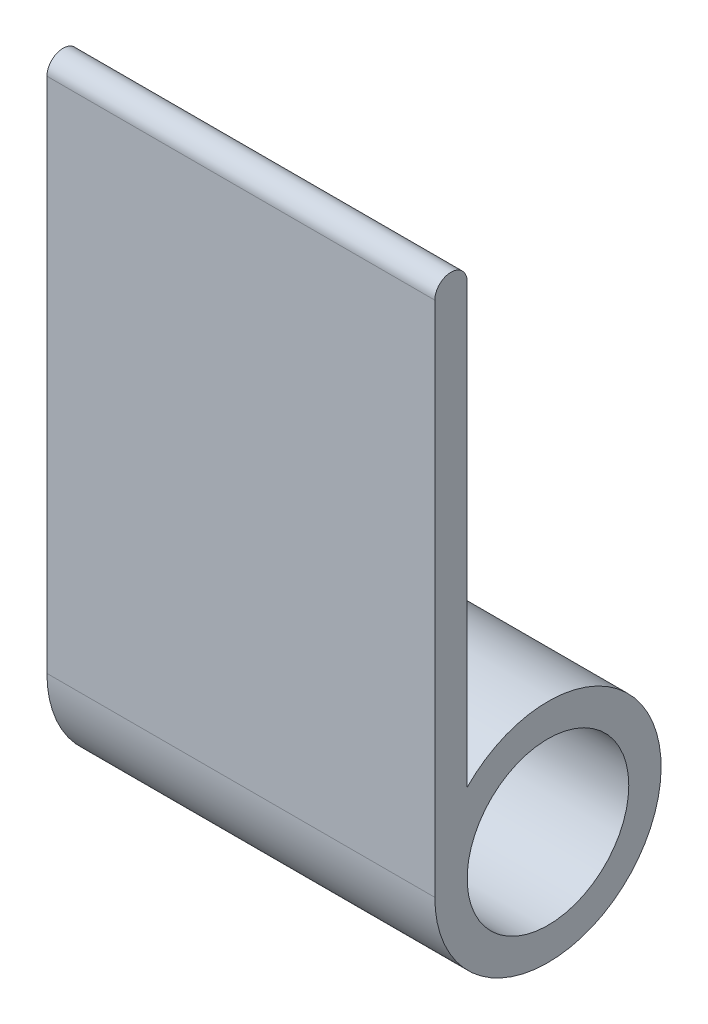
ISO-10303-21;
HEADER;
FILE_DESCRIPTION(('STEP AP214'),'2;1');
FILE_NAME('part.step','',(''),(''),'','','');
FILE_SCHEMA(('AUTOMOTIVE_DESIGN { 1 0 10303 214 1 1 1 1 }'));
ENDSEC;
DATA;
#1=APPLICATION_CONTEXT('core data for automotive mechanical design processes');
#2=APPLICATION_PROTOCOL_DEFINITION('international standard','automotive_design',2000,#1);
#3=PRODUCT_CONTEXT('',#1,'mechanical');
#4=PRODUCT('Part','Part','',(#3));
#5=PRODUCT_RELATED_PRODUCT_CATEGORY('part','',(#4));
#6=PRODUCT_DEFINITION_FORMATION('','',#4);
#7=PRODUCT_DEFINITION_CONTEXT('part definition',#1,'design');
#8=PRODUCT_DEFINITION('design','',#6,#7);
#9=PRODUCT_DEFINITION_SHAPE('','',#8);
#10=(LENGTH_UNIT() NAMED_UNIT(*) SI_UNIT(.MILLI.,.METRE.));
#11=(NAMED_UNIT(*) PLANE_ANGLE_UNIT() SI_UNIT($,.RADIAN.));
#12=(NAMED_UNIT(*) SI_UNIT($,.STERADIAN.) SOLID_ANGLE_UNIT());
#13=UNCERTAINTY_MEASURE_WITH_UNIT(LENGTH_MEASURE(1.E-05),#10,'distance_accuracy_value','');
#14=(GEOMETRIC_REPRESENTATION_CONTEXT(3) GLOBAL_UNCERTAINTY_ASSIGNED_CONTEXT((#13)) GLOBAL_UNIT_ASSIGNED_CONTEXT((#10,
#11,#12)) REPRESENTATION_CONTEXT('',''));
#15=CARTESIAN_POINT('',(0.,0.,0.));
#16=DIRECTION('',(0.,0.,1.));
#17=DIRECTION('',(1.,0.,0.));
#18=AXIS2_PLACEMENT_3D('',#15,#16,#17);
#19=CARTESIAN_POINT('',(60.,80.,12.5));
#20=DIRECTION('',(0.,0.,1.));
#21=DIRECTION('',(0.,-1.,0.));
#22=AXIS2_PLACEMENT_3D('',#19,#20,#21);
#23=PLANE('',#22);
#24=DIRECTION('',(-1.,0.,0.));
#25=VECTOR('',#24,1.);
#26=CARTESIAN_POINT('',(5.,41.9205080756888,12.5));
#27=LINE('',#26,#25);
#28=CARTESIAN_POINT('',(5.,41.9205080756888,12.5));
#29=VERTEX_POINT('',#28);
#30=CARTESIAN_POINT('',(0.,41.9205080756888,12.5));
#31=VERTEX_POINT('',#30);
#32=EDGE_CURVE('E147',#29,#31,#27,.T.);
#33=ORIENTED_EDGE('',*,*,#32,.T.);
#34=DIRECTION('',(0.,1.,0.));
#35=VECTOR('',#34,1.);
#36=CARTESIAN_POINT('',(0.,80.,12.5));
#37=LINE('',#36,#35);
#38=CARTESIAN_POINT('',(0.,80.,12.5));
#39=VERTEX_POINT('',#38);
#40=EDGE_CURVE('E182',#31,#39,#37,.T.);
#41=ORIENTED_EDGE('',*,*,#40,.T.);
#42=DIRECTION('',(-1.,0.,0.));
#43=VECTOR('',#42,1.);
#44=CARTESIAN_POINT('',(60.,80.,12.5));
#45=LINE('',#44,#43);
#46=CARTESIAN_POINT('',(60.,80.,12.5));
#47=VERTEX_POINT('',#46);
#48=EDGE_CURVE('E191',#47,#39,#45,.T.);
#49=ORIENTED_EDGE('',*,*,#48,.F.);
#50=DIRECTION('',(0.,1.,0.));
#51=VECTOR('',#50,1.);
#52=CARTESIAN_POINT('',(60.,80.,12.5));
#53=LINE('',#52,#51);
#54=CARTESIAN_POINT('',(60.,12.2474487139159,12.5));
#55=VERTEX_POINT('',#54);
#56=EDGE_CURVE('E188',#55,#47,#53,.T.);
#57=ORIENTED_EDGE('',*,*,#56,.F.);
#58=DIRECTION('',(-1.,0.,0.));
#59=VECTOR('',#58,1.);
#60=CARTESIAN_POINT('',(60.,12.2474487139159,12.5));
#61=LINE('',#60,#59);
#62=CARTESIAN_POINT('',(5.,12.2474487139159,12.5));
#63=VERTEX_POINT('',#62);
#64=EDGE_CURVE('E205',#55,#63,#61,.T.);
#65=ORIENTED_EDGE('',*,*,#64,.T.);
#66=DIRECTION('',(0.,1.,0.));
#67=VECTOR('',#66,1.);
#68=CARTESIAN_POINT('',(5.,0.,12.5));
#69=LINE('',#68,#67);
#70=EDGE_CURVE('E137',#63,#29,#69,.T.);
#71=ORIENTED_EDGE('',*,*,#70,.T.);
#72=EDGE_LOOP('',(#33,#41,#49,#57,#65,#71));
#73=FACE_BOUND('',#72,.T.);
#74=ADVANCED_FACE('F43',(#73),#23,.F.);
#75=CARTESIAN_POINT('',(60.,80.,15.));
#76=DIRECTION('',(-1.,0.,0.));
#77=DIRECTION('',(0.,0.,1.));
#78=AXIS2_PLACEMENT_3D('',#75,#76,#77);
#79=PLANE('',#78);
#80=CARTESIAN_POINT('',(60.,80.,15.));
#81=DIRECTION('',(1.,0.,0.));
#82=DIRECTION('',(0.,0.,1.));
#83=AXIS2_PLACEMENT_3D('',#80,#81,#82);
#84=CIRCLE('',#83,2.5);
#85=CARTESIAN_POINT('',(60.,80.,17.5));
#86=VERTEX_POINT('',#85);
#87=EDGE_CURVE('E177',#47,#86,#84,.T.);
#88=ORIENTED_EDGE('',*,*,#87,.T.);
#89=DIRECTION('',(0.,-1.,0.));
#90=VECTOR('',#89,1.);
#91=CARTESIAN_POINT('',(60.,0.,17.5));
#92=LINE('',#91,#90);
#93=CARTESIAN_POINT('',(60.,0.,17.5));
#94=VERTEX_POINT('',#93);
#95=EDGE_CURVE('E181',#86,#94,#92,.T.);
#96=ORIENTED_EDGE('',*,*,#95,.T.);
#97=CARTESIAN_POINT('',(60.,0.,0.));
#98=DIRECTION('',(1.,0.,0.));
#99=DIRECTION('',(0.,0.,-1.));
#100=AXIS2_PLACEMENT_3D('',#97,#98,#99);
#101=CIRCLE('',#100,17.5);
#102=EDGE_CURVE('E185',#94,#55,#101,.T.);
#103=ORIENTED_EDGE('',*,*,#102,.T.);
#104=ORIENTED_EDGE('',*,*,#56,.T.);
#105=EDGE_LOOP('',(#88,#96,#103,#104));
#106=FACE_BOUND('',#105,.T.);
#107=CARTESIAN_POINT('',(60.,0.,0.));
#108=DIRECTION('',(1.,0.,0.));
#109=DIRECTION('',(0.,0.,-1.));
#110=AXIS2_PLACEMENT_3D('',#107,#108,#109);
#111=CIRCLE('',#110,12.5);
#112=CARTESIAN_POINT('',(60.,0.,-12.5));
#113=VERTEX_POINT('',#112);
#114=EDGE_CURVE('E169',#113,#113,#111,.T.);
#115=ORIENTED_EDGE('',*,*,#114,.F.);
#116=EDGE_LOOP('',(#115));
#117=FACE_BOUND('',#116,.T.);
#118=ADVANCED_FACE('F228',(#106,#117),#79,.F.);
#119=CARTESIAN_POINT('',(0.,80.,15.));
#120=DIRECTION('',(-1.,0.,0.));
#121=DIRECTION('',(0.,0.,1.));
#122=AXIS2_PLACEMENT_3D('',#119,#120,#121);
#123=PLANE('',#122);
#124=CARTESIAN_POINT('',(0.,80.,15.));
#125=DIRECTION('',(1.,0.,0.));
#126=DIRECTION('',(0.,0.,1.));
#127=AXIS2_PLACEMENT_3D('',#124,#125,#126);
#128=CIRCLE('',#127,2.5);
#129=CARTESIAN_POINT('',(0.,80.,17.5));
#130=VERTEX_POINT('',#129);
#131=EDGE_CURVE('E173',#39,#130,#128,.T.);
#132=ORIENTED_EDGE('',*,*,#131,.F.);
#133=ORIENTED_EDGE('',*,*,#40,.F.);
#134=DIRECTION('',(0.,0.,1.));
#135=VECTOR('',#134,1.);
#136=CARTESIAN_POINT('',(0.,41.9205080756888,0.));
#137=LINE('',#136,#135);
#138=CARTESIAN_POINT('',(0.,41.9205080756888,-2.5));
#139=VERTEX_POINT('',#138);
#140=EDGE_CURVE('E153',#139,#31,#137,.T.);
#141=ORIENTED_EDGE('',*,*,#140,.F.);
#142=CARTESIAN_POINT('',(0.,33.3205080756888,-2.5));
#143=DIRECTION('',(1.,0.,0.));
#144=DIRECTION('',(0.,0.,-1.));
#145=AXIS2_PLACEMENT_3D('',#142,#143,#144);
#146=CIRCLE('',#145,8.6);
#147=CARTESIAN_POINT('',(0.,24.7205080756888,-2.5));
#148=VERTEX_POINT('',#147);
#149=EDGE_CURVE('E150',#139,#148,#146,.F.);
#150=ORIENTED_EDGE('',*,*,#149,.T.);
#151=DIRECTION('',(0.,-1.,0.));
#152=VECTOR('',#151,1.);
#153=CARTESIAN_POINT('',(0.,0.,-2.5));
#154=LINE('',#153,#152);
#155=CARTESIAN_POINT('',(0.,17.3205080756888,-2.5));
#156=VERTEX_POINT('',#155);
#157=EDGE_CURVE('E113',#148,#156,#154,.T.);
#158=ORIENTED_EDGE('',*,*,#157,.T.);
#159=CARTESIAN_POINT('',(0.,0.,0.));
#160=DIRECTION('',(1.,0.,0.));
#161=DIRECTION('',(0.,0.,-1.));
#162=AXIS2_PLACEMENT_3D('',#159,#160,#161);
#163=CIRCLE('',#162,17.5);
#164=CARTESIAN_POINT('',(0.,0.,17.5));
#165=VERTEX_POINT('',#164);
#166=EDGE_CURVE('E64',#165,#156,#163,.T.);
#167=ORIENTED_EDGE('',*,*,#166,.F.);
#168=DIRECTION('',(0.,-1.,0.));
#169=VECTOR('',#168,1.);
#170=CARTESIAN_POINT('',(0.,0.,17.5));
#171=LINE('',#170,#169);
#172=EDGE_CURVE('E195',#130,#165,#171,.T.);
#173=ORIENTED_EDGE('',*,*,#172,.F.);
#174=EDGE_LOOP('',(#132,#133,#141,#150,#158,#167,#173));
#175=FACE_BOUND('',#174,.T.);
#176=CARTESIAN_POINT('',(0.,0.,0.));
#177=DIRECTION('',(1.,0.,0.));
#178=DIRECTION('',(0.,0.,-1.));
#179=AXIS2_PLACEMENT_3D('',#176,#177,#178);
#180=CIRCLE('',#179,12.5);
#181=CARTESIAN_POINT('',(0.,0.,-12.5));
#182=VERTEX_POINT('',#181);
#183=EDGE_CURVE('E168',#182,#182,#180,.T.);
#184=ORIENTED_EDGE('',*,*,#183,.T.);
#185=EDGE_LOOP('',(#184));
#186=FACE_BOUND('',#185,.T.);
#187=CARTESIAN_POINT('',(0.,33.3205080756888,-2.5));
#188=DIRECTION('',(1.,0.,0.));
#189=DIRECTION('',(0.,0.,-1.));
#190=AXIS2_PLACEMENT_3D('',#187,#188,#189);
#191=CIRCLE('',#190,5.6);
#192=CARTESIAN_POINT('',(0.,33.3205080756888,-8.1));
#193=VERTEX_POINT('',#192);
#194=EDGE_CURVE('E157',#193,#193,#191,.T.);
#195=ORIENTED_EDGE('',*,*,#194,.T.);
#196=EDGE_LOOP('',(#195));
#197=FACE_BOUND('',#196,.T.);
#198=ADVANCED_FACE('F216',(#175,#186,#197),#123,.T.);
#199=CARTESIAN_POINT('',(60.,80.,15.));
#200=DIRECTION('',(-1.,0.,0.));
#201=DIRECTION('',(0.,0.,1.));
#202=AXIS2_PLACEMENT_3D('',#199,#200,#201);
#203=CYLINDRICAL_SURFACE('',#202,2.5);
#204=ORIENTED_EDGE('',*,*,#131,.T.);
#205=DIRECTION('',(-1.,0.,0.));
#206=VECTOR('',#205,1.);
#207=CARTESIAN_POINT('',(60.,80.,17.5));
#208=LINE('',#207,#206);
#209=EDGE_CURVE('E11',#86,#130,#208,.T.);
#210=ORIENTED_EDGE('',*,*,#209,.F.);
#211=ORIENTED_EDGE('',*,*,#87,.F.);
#212=ORIENTED_EDGE('',*,*,#48,.T.);
#213=EDGE_LOOP('',(#204,#210,#211,#212));
#214=FACE_BOUND('',#213,.T.);
#215=ADVANCED_FACE('F45',(#214),#203,.T.);
#216=CARTESIAN_POINT('',(60.,0.,17.5));
#217=DIRECTION('',(0.,0.,-1.));
#218=DIRECTION('',(0.,1.,0.));
#219=AXIS2_PLACEMENT_3D('',#216,#217,#218);
#220=PLANE('',#219);
#221=ORIENTED_EDGE('',*,*,#172,.T.);
#222=DIRECTION('',(-1.,0.,0.));
#223=VECTOR('',#222,1.);
#224=CARTESIAN_POINT('',(60.,0.,17.5));
#225=LINE('',#224,#223);
#226=EDGE_CURVE('E52',#94,#165,#225,.T.);
#227=ORIENTED_EDGE('',*,*,#226,.F.);
#228=ORIENTED_EDGE('',*,*,#95,.F.);
#229=ORIENTED_EDGE('',*,*,#209,.T.);
#230=EDGE_LOOP('',(#221,#227,#228,#229));
#231=FACE_BOUND('',#230,.T.);
#232=ADVANCED_FACE('F231',(#231),#220,.F.);
#233=CARTESIAN_POINT('',(60.,0.,0.));
#234=DIRECTION('',(-1.,0.,0.));
#235=DIRECTION('',(0.,0.,1.));
#236=AXIS2_PLACEMENT_3D('',#233,#234,#235);
#237=CYLINDRICAL_SURFACE('',#236,17.5);
#238=ORIENTED_EDGE('',*,*,#166,.T.);
#239=DIRECTION('',(-1.,0.,0.));
#240=VECTOR('',#239,1.);
#241=CARTESIAN_POINT('',(5.,17.3205080756888,-2.5));
#242=LINE('',#241,#240);
#243=CARTESIAN_POINT('',(5.,17.3205080756888,-2.5));
#244=VERTEX_POINT('',#243);
#245=EDGE_CURVE('E59',#244,#156,#242,.T.);
#246=ORIENTED_EDGE('',*,*,#245,.F.);
#247=CARTESIAN_POINT('',(5.,0.,0.));
#248=DIRECTION('',(1.,0.,0.));
#249=DIRECTION('',(0.,0.,-1.));
#250=AXIS2_PLACEMENT_3D('',#247,#248,#249);
#251=CIRCLE('',#250,17.5);
#252=EDGE_CURVE('E128',#244,#63,#251,.T.);
#253=ORIENTED_EDGE('',*,*,#252,.T.);
#254=ORIENTED_EDGE('',*,*,#64,.F.);
#255=ORIENTED_EDGE('',*,*,#102,.F.);
#256=ORIENTED_EDGE('',*,*,#226,.T.);
#257=EDGE_LOOP('',(#238,#246,#253,#254,#255,#256));
#258=FACE_BOUND('',#257,.T.);
#259=ADVANCED_FACE('F211',(#258),#237,.T.);
#260=CARTESIAN_POINT('',(60.,0.,0.));
#261=DIRECTION('',(-1.,0.,0.));
#262=DIRECTION('',(0.,0.,1.));
#263=AXIS2_PLACEMENT_3D('',#260,#261,#262);
#264=CYLINDRICAL_SURFACE('',#263,12.5);
#265=ORIENTED_EDGE('',*,*,#114,.T.);
#266=EDGE_LOOP('',(#265));
#267=FACE_BOUND('',#266,.T.);
#268=ORIENTED_EDGE('',*,*,#183,.F.);
#269=EDGE_LOOP('',(#268));
#270=FACE_BOUND('',#269,.T.);
#271=ADVANCED_FACE('F247',(#267,#270),#264,.F.);
#272=CARTESIAN_POINT('',(5.,0.,-2.5));
#273=DIRECTION('',(0.,0.,-1.));
#274=DIRECTION('',(0.,1.,0.));
#275=AXIS2_PLACEMENT_3D('',#272,#273,#274);
#276=PLANE('',#275);
#277=ORIENTED_EDGE('',*,*,#157,.F.);
#278=DIRECTION('',(-1.,0.,0.));
#279=VECTOR('',#278,1.);
#280=CARTESIAN_POINT('',(5.,24.7205080756888,-2.5));
#281=LINE('',#280,#279);
#282=CARTESIAN_POINT('',(5.,24.7205080756888,-2.5));
#283=VERTEX_POINT('',#282);
#284=EDGE_CURVE('E108',#283,#148,#281,.T.);
#285=ORIENTED_EDGE('',*,*,#284,.F.);
#286=DIRECTION('',(0.,-1.,0.));
#287=VECTOR('',#286,1.);
#288=CARTESIAN_POINT('',(5.,0.,-2.5));
#289=LINE('',#288,#287);
#290=EDGE_CURVE('E111',#283,#244,#289,.T.);
#291=ORIENTED_EDGE('',*,*,#290,.T.);
#292=ORIENTED_EDGE('',*,*,#245,.T.);
#293=EDGE_LOOP('',(#277,#285,#291,#292));
#294=FACE_BOUND('',#293,.T.);
#295=ADVANCED_FACE('F110',(#294),#276,.T.);
#296=CARTESIAN_POINT('',(5.,33.3205080756888,-2.5));
#297=DIRECTION('',(-1.,0.,0.));
#298=DIRECTION('',(0.,0.,1.));
#299=AXIS2_PLACEMENT_3D('',#296,#297,#298);
#300=CYLINDRICAL_SURFACE('',#299,8.6);
#301=ORIENTED_EDGE('',*,*,#149,.F.);
#302=DIRECTION('',(-1.,0.,0.));
#303=VECTOR('',#302,1.);
#304=CARTESIAN_POINT('',(5.,41.9205080756888,-2.5));
#305=LINE('',#304,#303);
#306=CARTESIAN_POINT('',(5.,41.9205080756888,-2.5));
#307=VERTEX_POINT('',#306);
#308=EDGE_CURVE('E119',#307,#139,#305,.T.);
#309=ORIENTED_EDGE('',*,*,#308,.F.);
#310=CARTESIAN_POINT('',(5.,33.3205080756888,-2.5));
#311=DIRECTION('',(1.,0.,0.));
#312=DIRECTION('',(0.,0.,-1.));
#313=AXIS2_PLACEMENT_3D('',#310,#311,#312);
#314=CIRCLE('',#313,8.6);
#315=EDGE_CURVE('E126',#307,#283,#314,.F.);
#316=ORIENTED_EDGE('',*,*,#315,.T.);
#317=ORIENTED_EDGE('',*,*,#284,.T.);
#318=EDGE_LOOP('',(#301,#309,#316,#317));
#319=FACE_BOUND('',#318,.T.);
#320=ADVANCED_FACE('F131',(#319),#300,.T.);
#321=CARTESIAN_POINT('',(5.,41.9205080756888,0.));
#322=DIRECTION('',(0.,-1.,0.));
#323=DIRECTION('',(0.,0.,-1.));
#324=AXIS2_PLACEMENT_3D('',#321,#322,#323);
#325=PLANE('',#324);
#326=ORIENTED_EDGE('',*,*,#140,.T.);
#327=ORIENTED_EDGE('',*,*,#32,.F.);
#328=DIRECTION('',(0.,0.,1.));
#329=VECTOR('',#328,1.);
#330=CARTESIAN_POINT('',(5.,41.9205080756888,0.));
#331=LINE('',#330,#329);
#332=EDGE_CURVE('E134',#307,#29,#331,.T.);
#333=ORIENTED_EDGE('',*,*,#332,.F.);
#334=ORIENTED_EDGE('',*,*,#308,.T.);
#335=EDGE_LOOP('',(#326,#327,#333,#334));
#336=FACE_BOUND('',#335,.T.);
#337=ADVANCED_FACE('F221',(#336),#325,.F.);
#338=CARTESIAN_POINT('',(5.,33.3205080756888,-2.5));
#339=DIRECTION('',(-1.,0.,0.));
#340=DIRECTION('',(0.,0.,1.));
#341=AXIS2_PLACEMENT_3D('',#338,#339,#340);
#342=CYLINDRICAL_SURFACE('',#341,5.6);
#343=CARTESIAN_POINT('',(5.,33.3205080756888,-2.5));
#344=DIRECTION('',(1.,0.,0.));
#345=DIRECTION('',(0.,0.,-1.));
#346=AXIS2_PLACEMENT_3D('',#343,#344,#345);
#347=CIRCLE('',#346,5.6);
#348=CARTESIAN_POINT('',(5.,33.3205080756888,-8.1));
#349=VERTEX_POINT('',#348);
#350=EDGE_CURVE('E143',#349,#349,#347,.T.);
#351=ORIENTED_EDGE('',*,*,#350,.T.);
#352=EDGE_LOOP('',(#351));
#353=FACE_BOUND('',#352,.T.);
#354=ORIENTED_EDGE('',*,*,#194,.F.);
#355=EDGE_LOOP('',(#354));
#356=FACE_BOUND('',#355,.T.);
#357=ADVANCED_FACE('F263',(#353,#356),#342,.F.);
#358=CARTESIAN_POINT('',(5.,0.,0.));
#359=DIRECTION('',(1.,0.,0.));
#360=DIRECTION('',(0.,0.,-1.));
#361=AXIS2_PLACEMENT_3D('',#358,#359,#360);
#362=PLANE('',#361);
#363=ORIENTED_EDGE('',*,*,#252,.F.);
#364=ORIENTED_EDGE('',*,*,#290,.F.);
#365=ORIENTED_EDGE('',*,*,#315,.F.);
#366=ORIENTED_EDGE('',*,*,#332,.T.);
#367=ORIENTED_EDGE('',*,*,#70,.F.);
#368=EDGE_LOOP('',(#363,#364,#365,#366,#367));
#369=FACE_BOUND('',#368,.T.);
#370=ORIENTED_EDGE('',*,*,#350,.F.);
#371=EDGE_LOOP('',(#370));
#372=FACE_BOUND('',#371,.T.);
#373=ADVANCED_FACE('F123',(#369,#372),#362,.T.);
#374=CLOSED_SHELL('',(#74,#118,#198,#215,#232,#259,#271,#295,#320,#337,#357,#373));
#375=MANIFOLD_SOLID_BREP('B2',#374);
#376=ADVANCED_BREP_SHAPE_REPRESENTATION('',(#18,#375),#14);
#377=SHAPE_DEFINITION_REPRESENTATION(#9,#376);
ENDSEC;
END-ISO-10303-21;
